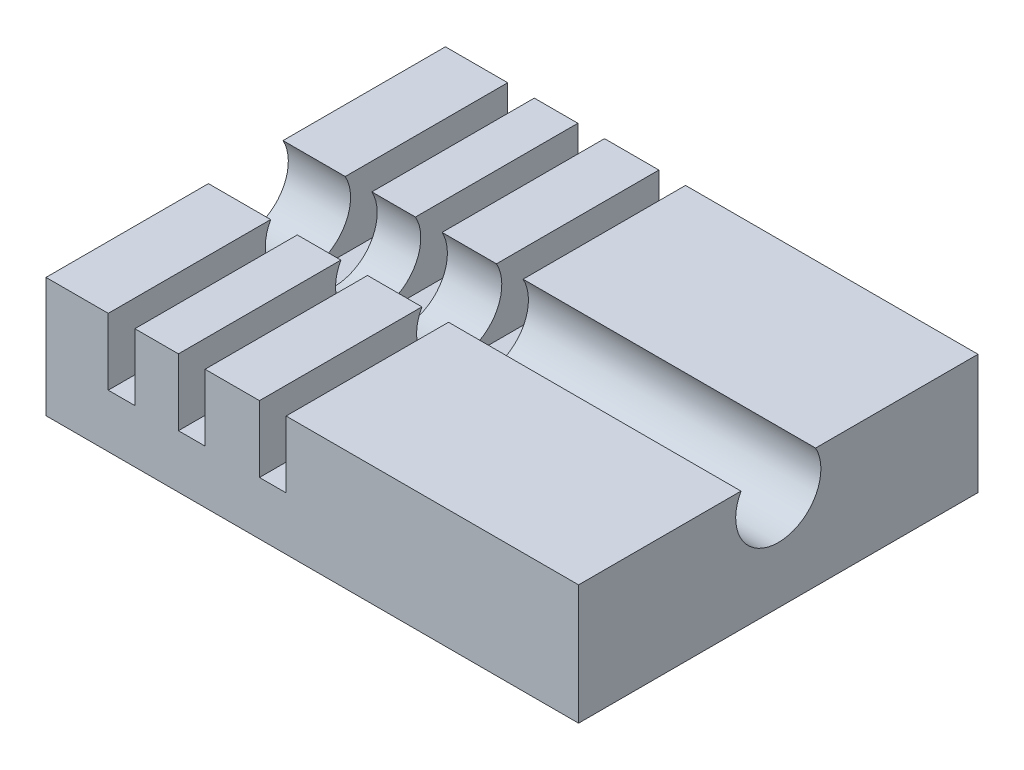
ISO-10303-21;
HEADER;
FILE_DESCRIPTION(('STEP AP214'),'2;1');
FILE_NAME('part.step','',(''),(''),'','','');
FILE_SCHEMA(('AUTOMOTIVE_DESIGN { 1 0 10303 214 1 1 1 1 }'));
ENDSEC;
DATA;
#1=APPLICATION_CONTEXT('core data for automotive mechanical design processes');
#2=APPLICATION_PROTOCOL_DEFINITION('international standard','automotive_design',2000,#1);
#3=PRODUCT_CONTEXT('',#1,'mechanical');
#4=PRODUCT('Part','Part','',(#3));
#5=PRODUCT_RELATED_PRODUCT_CATEGORY('part','',(#4));
#6=PRODUCT_DEFINITION_FORMATION('','',#4);
#7=PRODUCT_DEFINITION_CONTEXT('part definition',#1,'design');
#8=PRODUCT_DEFINITION('design','',#6,#7);
#9=PRODUCT_DEFINITION_SHAPE('','',#8);
#10=(LENGTH_UNIT() NAMED_UNIT(*) SI_UNIT(.MILLI.,.METRE.));
#11=(NAMED_UNIT(*) PLANE_ANGLE_UNIT() SI_UNIT($,.RADIAN.));
#12=(NAMED_UNIT(*) SI_UNIT($,.STERADIAN.) SOLID_ANGLE_UNIT());
#13=UNCERTAINTY_MEASURE_WITH_UNIT(LENGTH_MEASURE(1.E-05),#10,'distance_accuracy_value','');
#14=(GEOMETRIC_REPRESENTATION_CONTEXT(3) GLOBAL_UNCERTAINTY_ASSIGNED_CONTEXT((#13)) GLOBAL_UNIT_ASSIGNED_CONTEXT((#10,
#11,#12)) REPRESENTATION_CONTEXT('',''));
#15=CARTESIAN_POINT('',(0.,0.,0.));
#16=DIRECTION('',(0.,0.,1.));
#17=DIRECTION('',(1.,0.,0.));
#18=AXIS2_PLACEMENT_3D('',#15,#16,#17);
#19=CARTESIAN_POINT('',(0.,4.5,0.));
#20=DIRECTION('',(0.,1.,0.));
#21=DIRECTION('',(0.,0.,1.));
#22=AXIS2_PLACEMENT_3D('',#19,#20,#21);
#23=PLANE('',#22);
#24=DIRECTION('',(0.,0.,1.));
#25=VECTOR('',#24,1.);
#26=CARTESIAN_POINT('',(-1.98336935220311,4.5,7.5));
#27=LINE('',#26,#25);
#28=CARTESIAN_POINT('',(-1.98336935220311,4.5,1.40037517663878));
#29=VERTEX_POINT('',#28);
#30=CARTESIAN_POINT('',(-1.98336935220311,4.5,7.5));
#31=VERTEX_POINT('',#30);
#32=EDGE_CURVE('E207',#29,#31,#27,.T.);
#33=ORIENTED_EDGE('',*,*,#32,.F.);
#34=DIRECTION('',(1.,0.,0.));
#35=VECTOR('',#34,1.);
#36=CARTESIAN_POINT('',(-10.,4.5,1.40037517663879));
#37=LINE('',#36,#35);
#38=CARTESIAN_POINT('',(-4.02621229831845,4.5,1.40037517663879));
#39=VERTEX_POINT('',#38);
#40=EDGE_CURVE('E421',#39,#29,#37,.T.);
#41=ORIENTED_EDGE('',*,*,#40,.F.);
#42=DIRECTION('',(0.,0.,-1.));
#43=VECTOR('',#42,1.);
#44=CARTESIAN_POINT('',(-4.02621229831846,4.5,7.5));
#45=LINE('',#44,#43);
#46=CARTESIAN_POINT('',(-4.02621229831846,4.5,7.5));
#47=VERTEX_POINT('',#46);
#48=EDGE_CURVE('E63',#47,#39,#45,.T.);
#49=ORIENTED_EDGE('',*,*,#48,.F.);
#50=DIRECTION('',(1.,0.,0.));
#51=VECTOR('',#50,1.);
#52=CARTESIAN_POINT('',(-9.99999999999999,4.5,7.5));
#53=LINE('',#52,#51);
#54=EDGE_CURVE('E454',#47,#31,#53,.T.);
#55=ORIENTED_EDGE('',*,*,#54,.T.);
#56=EDGE_LOOP('',(#33,#41,#49,#55));
#57=FACE_BOUND('',#56,.T.);
#58=ADVANCED_FACE('F39',(#57),#23,.T.);
#59=CARTESIAN_POINT('',(-1.98336935220311,4.5,-7.5));
#60=VERTEX_POINT('',#59);
#61=CARTESIAN_POINT('',(-1.98336935220311,4.5,-1.40037517663878));
#62=VERTEX_POINT('',#61);
#63=EDGE_CURVE('E236',#60,#62,#27,.T.);
#64=ORIENTED_EDGE('',*,*,#63,.F.);
#65=DIRECTION('',(-1.,0.,0.));
#66=VECTOR('',#65,1.);
#67=CARTESIAN_POINT('',(-10.,4.5,-7.5));
#68=LINE('',#67,#66);
#69=CARTESIAN_POINT('',(-4.02621229831845,4.5,-7.5));
#70=VERTEX_POINT('',#69);
#71=EDGE_CURVE('E345',#60,#70,#68,.T.);
#72=ORIENTED_EDGE('',*,*,#71,.T.);
#73=CARTESIAN_POINT('',(-4.02621229831845,4.5,-1.40037517663878));
#74=VERTEX_POINT('',#73);
#75=EDGE_CURVE('E272',#74,#70,#45,.T.);
#76=ORIENTED_EDGE('',*,*,#75,.F.);
#77=DIRECTION('',(1.,0.,0.));
#78=VECTOR('',#77,1.);
#79=CARTESIAN_POINT('',(-10.,4.5,-1.40037517663878));
#80=LINE('',#79,#78);
#81=EDGE_CURVE('E390',#62,#74,#80,.F.);
#82=ORIENTED_EDGE('',*,*,#81,.F.);
#83=EDGE_LOOP('',(#64,#72,#76,#82));
#84=FACE_BOUND('',#83,.T.);
#85=ADVANCED_FACE('F466',(#84),#23,.T.);
#86=CARTESIAN_POINT('',(-10.,3.72608181010271,0.));
#87=DIRECTION('',(1.,0.,0.));
#88=DIRECTION('',(0.,0.,-1.));
#89=AXIS2_PLACEMENT_3D('',#86,#87,#88);
#90=CYLINDRICAL_SURFACE('',#89,1.6);
#91=ORIENTED_EDGE('',*,*,#40,.T.);
#92=CARTESIAN_POINT('',(-1.98336935220311,3.72608181010271,0.));
#93=DIRECTION('',(-1.,0.,0.));
#94=DIRECTION('',(0.,0.,1.));
#95=AXIS2_PLACEMENT_3D('',#92,#93,#94);
#96=CIRCLE('',#95,1.6);
#97=EDGE_CURVE('E11',#29,#62,#96,.F.);
#98=ORIENTED_EDGE('',*,*,#97,.T.);
#99=ORIENTED_EDGE('',*,*,#81,.T.);
#100=CARTESIAN_POINT('',(-4.02621229831846,3.72608181010271,0.));
#101=DIRECTION('',(1.,0.,0.));
#102=DIRECTION('',(0.,0.,-1.));
#103=AXIS2_PLACEMENT_3D('',#100,#101,#102);
#104=CIRCLE('',#103,1.6);
#105=EDGE_CURVE('E404',#74,#39,#104,.F.);
#106=ORIENTED_EDGE('',*,*,#105,.T.);
#107=EDGE_LOOP('',(#91,#98,#99,#106));
#108=FACE_BOUND('',#107,.T.);
#109=ADVANCED_FACE('F461',(#108),#90,.F.);
#110=DIRECTION('',(0.,0.,1.));
#111=VECTOR('',#110,1.);
#112=CARTESIAN_POINT('',(-5.02621229831846,4.5,7.5));
#113=LINE('',#112,#111);
#114=CARTESIAN_POINT('',(-5.02621229831846,4.5,1.40037517663879));
#115=VERTEX_POINT('',#114);
#116=CARTESIAN_POINT('',(-5.02621229831846,4.5,7.5));
#117=VERTEX_POINT('',#116);
#118=EDGE_CURVE('E245',#115,#117,#113,.T.);
#119=ORIENTED_EDGE('',*,*,#118,.F.);
#120=CARTESIAN_POINT('',(-6.66235726143166,4.5,1.40037517663879));
#121=VERTEX_POINT('',#120);
#122=EDGE_CURVE('E396',#121,#115,#37,.T.);
#123=ORIENTED_EDGE('',*,*,#122,.F.);
#124=DIRECTION('',(0.,0.,-1.));
#125=VECTOR('',#124,1.);
#126=CARTESIAN_POINT('',(-6.66235726143166,4.5,-7.5));
#127=LINE('',#126,#125);
#128=CARTESIAN_POINT('',(-6.66235726143166,4.5,7.5));
#129=VERTEX_POINT('',#128);
#130=EDGE_CURVE('E294',#129,#121,#127,.T.);
#131=ORIENTED_EDGE('',*,*,#130,.F.);
#132=EDGE_CURVE('E356',#129,#117,#53,.T.);
#133=ORIENTED_EDGE('',*,*,#132,.T.);
#134=EDGE_LOOP('',(#119,#123,#131,#133));
#135=FACE_BOUND('',#134,.T.);
#136=ADVANCED_FACE('F436',(#135),#23,.T.);
#137=CARTESIAN_POINT('',(-5.02621229831846,4.5,-7.5));
#138=VERTEX_POINT('',#137);
#139=CARTESIAN_POINT('',(-5.02621229831846,4.5,-1.40037517663878));
#140=VERTEX_POINT('',#139);
#141=EDGE_CURVE('E269',#138,#140,#113,.T.);
#142=ORIENTED_EDGE('',*,*,#141,.F.);
#143=CARTESIAN_POINT('',(-6.66235726143166,4.5,-7.5));
#144=VERTEX_POINT('',#143);
#145=EDGE_CURVE('E449',#138,#144,#68,.T.);
#146=ORIENTED_EDGE('',*,*,#145,.T.);
#147=CARTESIAN_POINT('',(-6.66235726143166,4.5,-1.40037517663878));
#148=VERTEX_POINT('',#147);
#149=EDGE_CURVE('E310',#148,#144,#127,.T.);
#150=ORIENTED_EDGE('',*,*,#149,.F.);
#151=EDGE_CURVE('E458',#140,#148,#80,.F.);
#152=ORIENTED_EDGE('',*,*,#151,.F.);
#153=EDGE_LOOP('',(#142,#146,#150,#152));
#154=FACE_BOUND('',#153,.T.);
#155=ADVANCED_FACE('F524',(#154),#23,.T.);
#156=ORIENTED_EDGE('',*,*,#122,.T.);
#157=CARTESIAN_POINT('',(-5.02621229831846,3.72608181010271,0.));
#158=DIRECTION('',(-1.,0.,0.));
#159=DIRECTION('',(0.,0.,1.));
#160=AXIS2_PLACEMENT_3D('',#157,#158,#159);
#161=CIRCLE('',#160,1.6);
#162=EDGE_CURVE('E407',#115,#140,#161,.F.);
#163=ORIENTED_EDGE('',*,*,#162,.T.);
#164=ORIENTED_EDGE('',*,*,#151,.T.);
#165=CARTESIAN_POINT('',(-6.66235726143166,3.72608181010271,0.));
#166=DIRECTION('',(1.,0.,0.));
#167=DIRECTION('',(0.,0.,-1.));
#168=AXIS2_PLACEMENT_3D('',#165,#166,#167);
#169=CIRCLE('',#168,1.6);
#170=EDGE_CURVE('E395',#148,#121,#169,.F.);
#171=ORIENTED_EDGE('',*,*,#170,.T.);
#172=EDGE_LOOP('',(#156,#163,#164,#171));
#173=FACE_BOUND('',#172,.T.);
#174=ADVANCED_FACE('F430',(#173),#90,.F.);
#175=DIRECTION('',(0.,0.,1.));
#176=VECTOR('',#175,1.);
#177=CARTESIAN_POINT('',(-7.66235726143166,4.5,-7.5));
#178=LINE('',#177,#176);
#179=CARTESIAN_POINT('',(-7.66235726143166,4.5,1.40037517663879));
#180=VERTEX_POINT('',#179);
#181=CARTESIAN_POINT('',(-7.66235726143166,4.5,7.5));
#182=VERTEX_POINT('',#181);
#183=EDGE_CURVE('E278',#180,#182,#178,.T.);
#184=ORIENTED_EDGE('',*,*,#183,.F.);
#185=CARTESIAN_POINT('',(-10.,4.5,1.40037517663879));
#186=VERTEX_POINT('',#185);
#187=EDGE_CURVE('E391',#186,#180,#37,.T.);
#188=ORIENTED_EDGE('',*,*,#187,.F.);
#189=DIRECTION('',(0.,0.,1.));
#190=VECTOR('',#189,1.);
#191=CARTESIAN_POINT('',(-10.,4.5,-7.5));
#192=LINE('',#191,#190);
#193=CARTESIAN_POINT('',(-9.99999999999999,4.5,7.5));
#194=VERTEX_POINT('',#193);
#195=EDGE_CURVE('E344',#186,#194,#192,.T.);
#196=ORIENTED_EDGE('',*,*,#195,.T.);
#197=EDGE_CURVE('E351',#194,#182,#53,.T.);
#198=ORIENTED_EDGE('',*,*,#197,.T.);
#199=EDGE_LOOP('',(#184,#188,#196,#198));
#200=FACE_BOUND('',#199,.T.);
#201=ADVANCED_FACE('F503',(#200),#23,.T.);
#202=CARTESIAN_POINT('',(-7.66235726143166,4.5,-7.5));
#203=VERTEX_POINT('',#202);
#204=CARTESIAN_POINT('',(-7.66235726143166,4.5,-1.40037517663878));
#205=VERTEX_POINT('',#204);
#206=EDGE_CURVE('E307',#203,#205,#178,.T.);
#207=ORIENTED_EDGE('',*,*,#206,.F.);
#208=CARTESIAN_POINT('',(-10.,4.5,-7.5));
#209=VERTEX_POINT('',#208);
#210=EDGE_CURVE('E338',#203,#209,#68,.T.);
#211=ORIENTED_EDGE('',*,*,#210,.T.);
#212=CARTESIAN_POINT('',(-10.,4.5,-1.40037517663878));
#213=VERTEX_POINT('',#212);
#214=EDGE_CURVE('E346',#209,#213,#192,.T.);
#215=ORIENTED_EDGE('',*,*,#214,.T.);
#216=EDGE_CURVE('E384',#205,#213,#80,.F.);
#217=ORIENTED_EDGE('',*,*,#216,.F.);
#218=EDGE_LOOP('',(#207,#211,#215,#217));
#219=FACE_BOUND('',#218,.T.);
#220=ADVANCED_FACE('F509',(#219),#23,.T.);
#221=ORIENTED_EDGE('',*,*,#187,.T.);
#222=CARTESIAN_POINT('',(-7.66235726143166,3.72608181010271,0.));
#223=DIRECTION('',(-1.,0.,0.));
#224=DIRECTION('',(0.,0.,1.));
#225=AXIS2_PLACEMENT_3D('',#222,#223,#224);
#226=CIRCLE('',#225,1.6);
#227=EDGE_CURVE('E400',#180,#205,#226,.F.);
#228=ORIENTED_EDGE('',*,*,#227,.T.);
#229=ORIENTED_EDGE('',*,*,#216,.T.);
#230=CARTESIAN_POINT('',(-10.,3.72608181010271,0.));
#231=DIRECTION('',(1.,0.,0.));
#232=DIRECTION('',(0.,0.,-1.));
#233=AXIS2_PLACEMENT_3D('',#230,#231,#232);
#234=CIRCLE('',#233,1.6);
#235=EDGE_CURVE('E327',#186,#213,#234,.T.);
#236=ORIENTED_EDGE('',*,*,#235,.F.);
#237=EDGE_LOOP('',(#221,#228,#229,#236));
#238=FACE_BOUND('',#237,.T.);
#239=ADVANCED_FACE('F505',(#238),#90,.F.);
#240=DIRECTION('',(0.,0.,-1.));
#241=VECTOR('',#240,1.);
#242=CARTESIAN_POINT('',(-0.983369352203113,4.5,7.5));
#243=LINE('',#242,#241);
#244=CARTESIAN_POINT('',(-0.983369352203113,4.5,7.5));
#245=VERTEX_POINT('',#244);
#246=CARTESIAN_POINT('',(-0.983369352203112,4.5,1.40037517663878));
#247=VERTEX_POINT('',#246);
#248=EDGE_CURVE('E55',#245,#247,#243,.T.);
#249=ORIENTED_EDGE('',*,*,#248,.F.);
#250=CARTESIAN_POINT('',(10.,4.5,7.5));
#251=VERTEX_POINT('',#250);
#252=EDGE_CURVE('E350',#245,#251,#53,.T.);
#253=ORIENTED_EDGE('',*,*,#252,.T.);
#254=DIRECTION('',(0.,0.,-1.));
#255=VECTOR('',#254,1.);
#256=CARTESIAN_POINT('',(10.,4.5,-7.5));
#257=LINE('',#256,#255);
#258=CARTESIAN_POINT('',(10.,4.5,1.40037517663878));
#259=VERTEX_POINT('',#258);
#260=EDGE_CURVE('E334',#251,#259,#257,.T.);
#261=ORIENTED_EDGE('',*,*,#260,.T.);
#262=EDGE_CURVE('E389',#247,#259,#37,.T.);
#263=ORIENTED_EDGE('',*,*,#262,.F.);
#264=EDGE_LOOP('',(#249,#253,#261,#263));
#265=FACE_BOUND('',#264,.T.);
#266=ADVANCED_FACE('F418',(#265),#23,.T.);
#267=CARTESIAN_POINT('',(10.,4.5,-7.5));
#268=DIRECTION('',(-1.,0.,0.));
#269=DIRECTION('',(0.,0.,1.));
#270=AXIS2_PLACEMENT_3D('',#267,#268,#269);
#271=PLANE('',#270);
#272=CARTESIAN_POINT('',(10.,4.5,-1.40037517663879));
#273=VERTEX_POINT('',#272);
#274=CARTESIAN_POINT('',(10.,4.5,-7.5));
#275=VERTEX_POINT('',#274);
#276=EDGE_CURVE('E339',#273,#275,#257,.T.);
#277=ORIENTED_EDGE('',*,*,#276,.F.);
#278=CARTESIAN_POINT('',(10.,3.72608181010271,0.));
#279=DIRECTION('',(1.,0.,0.));
#280=DIRECTION('',(0.,0.,-1.));
#281=AXIS2_PLACEMENT_3D('',#278,#279,#280);
#282=CIRCLE('',#281,1.6);
#283=EDGE_CURVE('E316',#259,#273,#282,.T.);
#284=ORIENTED_EDGE('',*,*,#283,.F.);
#285=ORIENTED_EDGE('',*,*,#260,.F.);
#286=DIRECTION('',(0.,-1.,0.));
#287=VECTOR('',#286,1.);
#288=CARTESIAN_POINT('',(10.,4.5,7.5));
#289=LINE('',#288,#287);
#290=CARTESIAN_POINT('',(10.,0.,7.5));
#291=VERTEX_POINT('',#290);
#292=EDGE_CURVE('E355',#251,#291,#289,.T.);
#293=ORIENTED_EDGE('',*,*,#292,.T.);
#294=DIRECTION('',(0.,0.,-1.));
#295=VECTOR('',#294,1.);
#296=CARTESIAN_POINT('',(10.,0.,-7.5));
#297=LINE('',#296,#295);
#298=CARTESIAN_POINT('',(10.,0.,-7.5));
#299=VERTEX_POINT('',#298);
#300=EDGE_CURVE('E331',#291,#299,#297,.T.);
#301=ORIENTED_EDGE('',*,*,#300,.T.);
#302=DIRECTION('',(0.,-1.,0.));
#303=VECTOR('',#302,1.);
#304=CARTESIAN_POINT('',(10.,4.5,-7.5));
#305=LINE('',#304,#303);
#306=EDGE_CURVE('E380',#275,#299,#305,.T.);
#307=ORIENTED_EDGE('',*,*,#306,.F.);
#308=EDGE_LOOP('',(#277,#284,#285,#293,#301,#307));
#309=FACE_BOUND('',#308,.T.);
#310=ADVANCED_FACE('F41',(#309),#271,.F.);
#311=CARTESIAN_POINT('',(-10.,4.5,-7.5));
#312=DIRECTION('',(0.,0.,1.));
#313=DIRECTION('',(1.,0.,0.));
#314=AXIS2_PLACEMENT_3D('',#311,#312,#313);
#315=PLANE('',#314);
#316=ORIENTED_EDGE('',*,*,#71,.F.);
#317=DIRECTION('',(0.,1.,0.));
#318=VECTOR('',#317,1.);
#319=CARTESIAN_POINT('',(-1.98336935220311,2.,-7.5));
#320=LINE('',#319,#318);
#321=CARTESIAN_POINT('',(-1.98336935220311,2.,-7.5));
#322=VERTEX_POINT('',#321);
#323=EDGE_CURVE('E242',#322,#60,#320,.T.);
#324=ORIENTED_EDGE('',*,*,#323,.F.);
#325=DIRECTION('',(-1.,0.,0.));
#326=VECTOR('',#325,1.);
#327=CARTESIAN_POINT('',(-1.98336935220311,2.,-7.5));
#328=LINE('',#327,#326);
#329=CARTESIAN_POINT('',(-0.983369352203112,2.,-7.5));
#330=VERTEX_POINT('',#329);
#331=EDGE_CURVE('E214',#330,#322,#328,.T.);
#332=ORIENTED_EDGE('',*,*,#331,.F.);
#333=DIRECTION('',(0.,1.,0.));
#334=VECTOR('',#333,1.);
#335=CARTESIAN_POINT('',(-0.983369352203112,2.,-7.5));
#336=LINE('',#335,#334);
#337=CARTESIAN_POINT('',(-0.983369352203112,4.5,-7.5));
#338=VERTEX_POINT('',#337);
#339=EDGE_CURVE('E246',#330,#338,#336,.T.);
#340=ORIENTED_EDGE('',*,*,#339,.T.);
#341=EDGE_CURVE('E340',#275,#338,#68,.T.);
#342=ORIENTED_EDGE('',*,*,#341,.F.);
#343=ORIENTED_EDGE('',*,*,#306,.T.);
#344=DIRECTION('',(-1.,0.,0.));
#345=VECTOR('',#344,1.);
#346=CARTESIAN_POINT('',(-10.,0.,-7.5));
#347=LINE('',#346,#345);
#348=CARTESIAN_POINT('',(-10.,0.,-7.5));
#349=VERTEX_POINT('',#348);
#350=EDGE_CURVE('E360',#299,#349,#347,.T.);
#351=ORIENTED_EDGE('',*,*,#350,.T.);
#352=DIRECTION('',(0.,-1.,0.));
#353=VECTOR('',#352,1.);
#354=CARTESIAN_POINT('',(-10.,4.5,-7.5));
#355=LINE('',#354,#353);
#356=EDGE_CURVE('E376',#209,#349,#355,.T.);
#357=ORIENTED_EDGE('',*,*,#356,.F.);
#358=ORIENTED_EDGE('',*,*,#210,.F.);
#359=DIRECTION('',(0.,1.,0.));
#360=VECTOR('',#359,1.);
#361=CARTESIAN_POINT('',(-7.66235726143166,2.,-7.5));
#362=LINE('',#361,#360);
#363=CARTESIAN_POINT('',(-7.66235726143166,2.,-7.5));
#364=VERTEX_POINT('',#363);
#365=EDGE_CURVE('E313',#364,#203,#362,.T.);
#366=ORIENTED_EDGE('',*,*,#365,.F.);
#367=DIRECTION('',(-1.,0.,0.));
#368=VECTOR('',#367,1.);
#369=CARTESIAN_POINT('',(-7.66235726143166,2.,-7.5));
#370=LINE('',#369,#368);
#371=CARTESIAN_POINT('',(-6.66235726143166,2.,-7.5));
#372=VERTEX_POINT('',#371);
#373=EDGE_CURVE('E302',#372,#364,#370,.T.);
#374=ORIENTED_EDGE('',*,*,#373,.F.);
#375=DIRECTION('',(0.,1.,0.));
#376=VECTOR('',#375,1.);
#377=CARTESIAN_POINT('',(-6.66235726143166,2.,-7.5));
#378=LINE('',#377,#376);
#379=EDGE_CURVE('E317',#372,#144,#378,.T.);
#380=ORIENTED_EDGE('',*,*,#379,.T.);
#381=ORIENTED_EDGE('',*,*,#145,.F.);
#382=DIRECTION('',(0.,1.,0.));
#383=VECTOR('',#382,1.);
#384=CARTESIAN_POINT('',(-5.02621229831846,2.,-7.5));
#385=LINE('',#384,#383);
#386=CARTESIAN_POINT('',(-5.02621229831846,2.,-7.5));
#387=VERTEX_POINT('',#386);
#388=EDGE_CURVE('E275',#387,#138,#385,.T.);
#389=ORIENTED_EDGE('',*,*,#388,.F.);
#390=DIRECTION('',(-1.,0.,0.));
#391=VECTOR('',#390,1.);
#392=CARTESIAN_POINT('',(-5.02621229831846,2.,-7.5));
#393=LINE('',#392,#391);
#394=CARTESIAN_POINT('',(-4.02621229831845,2.,-7.5));
#395=VERTEX_POINT('',#394);
#396=EDGE_CURVE('E264',#395,#387,#393,.T.);
#397=ORIENTED_EDGE('',*,*,#396,.F.);
#398=DIRECTION('',(0.,1.,0.));
#399=VECTOR('',#398,1.);
#400=CARTESIAN_POINT('',(-4.02621229831845,2.,-7.5));
#401=LINE('',#400,#399);
#402=EDGE_CURVE('E279',#395,#70,#401,.T.);
#403=ORIENTED_EDGE('',*,*,#402,.T.);
#404=EDGE_LOOP('',(#316,#324,#332,#340,#342,#343,#351,#357,#358,#366,#374,#380,#381,#389,#397,#403));
#405=FACE_BOUND('',#404,.T.);
#406=ADVANCED_FACE('F469',(#405),#315,.F.);
#407=CARTESIAN_POINT('',(-10.,4.5,-7.5));
#408=DIRECTION('',(1.,0.,0.));
#409=DIRECTION('',(0.,0.,-1.));
#410=AXIS2_PLACEMENT_3D('',#407,#408,#409);
#411=PLANE('',#410);
#412=ORIENTED_EDGE('',*,*,#195,.F.);
#413=ORIENTED_EDGE('',*,*,#235,.T.);
#414=ORIENTED_EDGE('',*,*,#214,.F.);
#415=ORIENTED_EDGE('',*,*,#356,.T.);
#416=DIRECTION('',(0.,0.,1.));
#417=VECTOR('',#416,1.);
#418=CARTESIAN_POINT('',(-10.,0.,-7.5));
#419=LINE('',#418,#417);
#420=CARTESIAN_POINT('',(-9.99999999999999,0.,7.5));
#421=VERTEX_POINT('',#420);
#422=EDGE_CURVE('E363',#349,#421,#419,.T.);
#423=ORIENTED_EDGE('',*,*,#422,.T.);
#424=DIRECTION('',(0.,-1.,0.));
#425=VECTOR('',#424,1.);
#426=CARTESIAN_POINT('',(-9.99999999999999,4.5,7.5));
#427=LINE('',#426,#425);
#428=EDGE_CURVE('E372',#194,#421,#427,.T.);
#429=ORIENTED_EDGE('',*,*,#428,.F.);
#430=EDGE_LOOP('',(#412,#413,#414,#415,#423,#429));
#431=FACE_BOUND('',#430,.T.);
#432=ADVANCED_FACE('F494',(#431),#411,.F.);
#433=CARTESIAN_POINT('',(-9.99999999999999,4.5,7.5));
#434=DIRECTION('',(0.,0.,-1.));
#435=DIRECTION('',(-1.,0.,0.));
#436=AXIS2_PLACEMENT_3D('',#433,#434,#435);
#437=PLANE('',#436);
#438=DIRECTION('',(1.,0.,0.));
#439=VECTOR('',#438,1.);
#440=CARTESIAN_POINT('',(-1.98336935220311,2.,7.5));
#441=LINE('',#440,#439);
#442=CARTESIAN_POINT('',(-1.98336935220311,2.,7.5));
#443=VERTEX_POINT('',#442);
#444=CARTESIAN_POINT('',(-0.983369352203113,2.,7.5));
#445=VERTEX_POINT('',#444);
#446=EDGE_CURVE('E220',#443,#445,#441,.T.);
#447=ORIENTED_EDGE('',*,*,#446,.F.);
#448=DIRECTION('',(0.,1.,0.));
#449=VECTOR('',#448,1.);
#450=CARTESIAN_POINT('',(-1.98336935220311,2.,7.5));
#451=LINE('',#450,#449);
#452=EDGE_CURVE('E201',#443,#31,#451,.T.);
#453=ORIENTED_EDGE('',*,*,#452,.T.);
#454=ORIENTED_EDGE('',*,*,#54,.F.);
#455=DIRECTION('',(0.,1.,0.));
#456=VECTOR('',#455,1.);
#457=CARTESIAN_POINT('',(-4.02621229831846,2.,7.5));
#458=LINE('',#457,#456);
#459=CARTESIAN_POINT('',(-4.02621229831846,2.,7.5));
#460=VERTEX_POINT('',#459);
#461=EDGE_CURVE('E283',#460,#47,#458,.T.);
#462=ORIENTED_EDGE('',*,*,#461,.F.);
#463=DIRECTION('',(1.,0.,0.));
#464=VECTOR('',#463,1.);
#465=CARTESIAN_POINT('',(-5.02621229831846,2.,7.5));
#466=LINE('',#465,#464);
#467=CARTESIAN_POINT('',(-5.02621229831846,2.,7.5));
#468=VERTEX_POINT('',#467);
#469=EDGE_CURVE('E256',#468,#460,#466,.T.);
#470=ORIENTED_EDGE('',*,*,#469,.F.);
#471=DIRECTION('',(0.,1.,0.));
#472=VECTOR('',#471,1.);
#473=CARTESIAN_POINT('',(-5.02621229831846,2.,7.5));
#474=LINE('',#473,#472);
#475=EDGE_CURVE('E268',#468,#117,#474,.T.);
#476=ORIENTED_EDGE('',*,*,#475,.T.);
#477=ORIENTED_EDGE('',*,*,#132,.F.);
#478=DIRECTION('',(0.,1.,0.));
#479=VECTOR('',#478,1.);
#480=CARTESIAN_POINT('',(-6.66235726143166,2.,7.5));
#481=LINE('',#480,#479);
#482=CARTESIAN_POINT('',(-6.66235726143166,2.,7.5));
#483=VERTEX_POINT('',#482);
#484=EDGE_CURVE('E321',#483,#129,#481,.T.);
#485=ORIENTED_EDGE('',*,*,#484,.F.);
#486=DIRECTION('',(1.,0.,0.));
#487=VECTOR('',#486,1.);
#488=CARTESIAN_POINT('',(-7.66235726143166,2.,7.5));
#489=LINE('',#488,#487);
#490=CARTESIAN_POINT('',(-7.66235726143166,2.,7.5));
#491=VERTEX_POINT('',#490);
#492=EDGE_CURVE('E293',#491,#483,#489,.T.);
#493=ORIENTED_EDGE('',*,*,#492,.F.);
#494=DIRECTION('',(0.,1.,0.));
#495=VECTOR('',#494,1.);
#496=CARTESIAN_POINT('',(-7.66235726143166,2.,7.5));
#497=LINE('',#496,#495);
#498=EDGE_CURVE('E306',#491,#182,#497,.T.);
#499=ORIENTED_EDGE('',*,*,#498,.T.);
#500=ORIENTED_EDGE('',*,*,#197,.F.);
#501=ORIENTED_EDGE('',*,*,#428,.T.);
#502=DIRECTION('',(1.,0.,0.));
#503=VECTOR('',#502,1.);
#504=CARTESIAN_POINT('',(-9.99999999999999,0.,7.5));
#505=LINE('',#504,#503);
#506=EDGE_CURVE('E366',#421,#291,#505,.T.);
#507=ORIENTED_EDGE('',*,*,#506,.T.);
#508=ORIENTED_EDGE('',*,*,#292,.F.);
#509=ORIENTED_EDGE('',*,*,#252,.F.);
#510=DIRECTION('',(0.,1.,0.));
#511=VECTOR('',#510,1.);
#512=CARTESIAN_POINT('',(-0.983369352203113,2.,7.5));
#513=LINE('',#512,#511);
#514=EDGE_CURVE('E213',#445,#245,#513,.T.);
#515=ORIENTED_EDGE('',*,*,#514,.F.);
#516=EDGE_LOOP('',(#447,#453,#454,#462,#470,#476,#477,#485,#493,#499,#500,#501,#507,#508,#509,#515));
#517=FACE_BOUND('',#516,.T.);
#518=ADVANCED_FACE('F226',(#517),#437,.F.);
#519=CARTESIAN_POINT('',(-0.983369352203112,4.5,-1.40037517663878));
#520=VERTEX_POINT('',#519);
#521=EDGE_CURVE('E239',#520,#338,#243,.T.);
#522=ORIENTED_EDGE('',*,*,#521,.F.);
#523=EDGE_CURVE('E385',#273,#520,#80,.F.);
#524=ORIENTED_EDGE('',*,*,#523,.F.);
#525=ORIENTED_EDGE('',*,*,#276,.T.);
#526=ORIENTED_EDGE('',*,*,#341,.T.);
#527=EDGE_LOOP('',(#522,#524,#525,#526));
#528=FACE_BOUND('',#527,.T.);
#529=ADVANCED_FACE('F483',(#528),#23,.T.);
#530=CARTESIAN_POINT('',(0.,0.,0.));
#531=DIRECTION('',(0.,1.,0.));
#532=DIRECTION('',(0.,0.,1.));
#533=AXIS2_PLACEMENT_3D('',#530,#531,#532);
#534=PLANE('',#533);
#535=ORIENTED_EDGE('',*,*,#300,.F.);
#536=ORIENTED_EDGE('',*,*,#506,.F.);
#537=ORIENTED_EDGE('',*,*,#422,.F.);
#538=ORIENTED_EDGE('',*,*,#350,.F.);
#539=EDGE_LOOP('',(#535,#536,#537,#538));
#540=FACE_BOUND('',#539,.T.);
#541=ADVANCED_FACE('F497',(#540),#534,.F.);
#542=ORIENTED_EDGE('',*,*,#523,.T.);
#543=CARTESIAN_POINT('',(-0.983369352203114,3.72608181010271,0.));
#544=DIRECTION('',(1.,0.,0.));
#545=DIRECTION('',(0.,0.,-1.));
#546=AXIS2_PLACEMENT_3D('',#543,#544,#545);
#547=CIRCLE('',#546,1.6);
#548=EDGE_CURVE('E48',#520,#247,#547,.F.);
#549=ORIENTED_EDGE('',*,*,#548,.T.);
#550=ORIENTED_EDGE('',*,*,#262,.T.);
#551=ORIENTED_EDGE('',*,*,#283,.T.);
#552=EDGE_LOOP('',(#542,#549,#550,#551));
#553=FACE_BOUND('',#552,.T.);
#554=ADVANCED_FACE('F413',(#553),#90,.F.);
#555=CARTESIAN_POINT('',(-7.66235726143166,2.,-7.5));
#556=DIRECTION('',(-1.,0.,0.));
#557=DIRECTION('',(0.,0.,1.));
#558=AXIS2_PLACEMENT_3D('',#555,#556,#557);
#559=PLANE('',#558);
#560=ORIENTED_EDGE('',*,*,#183,.T.);
#561=ORIENTED_EDGE('',*,*,#498,.F.);
#562=DIRECTION('',(0.,0.,1.));
#563=VECTOR('',#562,1.);
#564=CARTESIAN_POINT('',(-7.66235726143166,2.,-7.5));
#565=LINE('',#564,#563);
#566=EDGE_CURVE('E289',#364,#491,#565,.T.);
#567=ORIENTED_EDGE('',*,*,#566,.F.);
#568=ORIENTED_EDGE('',*,*,#365,.T.);
#569=ORIENTED_EDGE('',*,*,#206,.T.);
#570=ORIENTED_EDGE('',*,*,#227,.F.);
#571=EDGE_LOOP('',(#560,#561,#567,#568,#569,#570));
#572=FACE_BOUND('',#571,.T.);
#573=ADVANCED_FACE('F513',(#572),#559,.F.);
#574=CARTESIAN_POINT('',(-6.66235726143166,2.,-7.5));
#575=DIRECTION('',(1.,0.,0.));
#576=DIRECTION('',(0.,0.,-1.));
#577=AXIS2_PLACEMENT_3D('',#574,#575,#576);
#578=PLANE('',#577);
#579=ORIENTED_EDGE('',*,*,#149,.T.);
#580=ORIENTED_EDGE('',*,*,#379,.F.);
#581=DIRECTION('',(0.,0.,-1.));
#582=VECTOR('',#581,1.);
#583=CARTESIAN_POINT('',(-6.66235726143166,2.,-7.5));
#584=LINE('',#583,#582);
#585=EDGE_CURVE('E298',#483,#372,#584,.T.);
#586=ORIENTED_EDGE('',*,*,#585,.F.);
#587=ORIENTED_EDGE('',*,*,#484,.T.);
#588=ORIENTED_EDGE('',*,*,#130,.T.);
#589=ORIENTED_EDGE('',*,*,#170,.F.);
#590=EDGE_LOOP('',(#579,#580,#586,#587,#588,#589));
#591=FACE_BOUND('',#590,.T.);
#592=ADVANCED_FACE('F519',(#591),#578,.F.);
#593=CARTESIAN_POINT('',(0.,2.,0.));
#594=DIRECTION('',(0.,1.,0.));
#595=DIRECTION('',(0.,0.,1.));
#596=AXIS2_PLACEMENT_3D('',#593,#594,#595);
#597=PLANE('',#596);
#598=ORIENTED_EDGE('',*,*,#566,.T.);
#599=ORIENTED_EDGE('',*,*,#492,.T.);
#600=ORIENTED_EDGE('',*,*,#585,.T.);
#601=ORIENTED_EDGE('',*,*,#373,.T.);
#602=EDGE_LOOP('',(#598,#599,#600,#601));
#603=FACE_BOUND('',#602,.T.);
#604=ADVANCED_FACE('F516',(#603),#597,.T.);
#605=CARTESIAN_POINT('',(-5.02621229831846,2.,7.5));
#606=DIRECTION('',(-1.,0.,0.));
#607=DIRECTION('',(0.,0.,1.));
#608=AXIS2_PLACEMENT_3D('',#605,#606,#607);
#609=PLANE('',#608);
#610=ORIENTED_EDGE('',*,*,#118,.T.);
#611=ORIENTED_EDGE('',*,*,#475,.F.);
#612=DIRECTION('',(0.,0.,1.));
#613=VECTOR('',#612,1.);
#614=CARTESIAN_POINT('',(-5.02621229831846,2.,7.5));
#615=LINE('',#614,#613);
#616=EDGE_CURVE('E252',#387,#468,#615,.T.);
#617=ORIENTED_EDGE('',*,*,#616,.F.);
#618=ORIENTED_EDGE('',*,*,#388,.T.);
#619=ORIENTED_EDGE('',*,*,#141,.T.);
#620=ORIENTED_EDGE('',*,*,#162,.F.);
#621=EDGE_LOOP('',(#610,#611,#617,#618,#619,#620));
#622=FACE_BOUND('',#621,.T.);
#623=ADVANCED_FACE('F525',(#622),#609,.F.);
#624=CARTESIAN_POINT('',(-4.02621229831846,2.,7.5));
#625=DIRECTION('',(1.,0.,0.));
#626=DIRECTION('',(0.,0.,-1.));
#627=AXIS2_PLACEMENT_3D('',#624,#625,#626);
#628=PLANE('',#627);
#629=ORIENTED_EDGE('',*,*,#75,.T.);
#630=ORIENTED_EDGE('',*,*,#402,.F.);
#631=DIRECTION('',(0.,0.,-1.));
#632=VECTOR('',#631,1.);
#633=CARTESIAN_POINT('',(-4.02621229831846,2.,7.5));
#634=LINE('',#633,#632);
#635=EDGE_CURVE('E260',#460,#395,#634,.T.);
#636=ORIENTED_EDGE('',*,*,#635,.F.);
#637=ORIENTED_EDGE('',*,*,#461,.T.);
#638=ORIENTED_EDGE('',*,*,#48,.T.);
#639=ORIENTED_EDGE('',*,*,#105,.F.);
#640=EDGE_LOOP('',(#629,#630,#636,#637,#638,#639));
#641=FACE_BOUND('',#640,.T.);
#642=ADVANCED_FACE('F465',(#641),#628,.F.);
#643=CARTESIAN_POINT('',(0.,2.,0.));
#644=DIRECTION('',(0.,-1.,0.));
#645=DIRECTION('',(0.,0.,-1.));
#646=AXIS2_PLACEMENT_3D('',#643,#644,#645);
#647=PLANE('',#646);
#648=ORIENTED_EDGE('',*,*,#616,.T.);
#649=ORIENTED_EDGE('',*,*,#469,.T.);
#650=ORIENTED_EDGE('',*,*,#635,.T.);
#651=ORIENTED_EDGE('',*,*,#396,.T.);
#652=EDGE_LOOP('',(#648,#649,#650,#651));
#653=FACE_BOUND('',#652,.T.);
#654=ADVANCED_FACE('F473',(#653),#647,.F.);
#655=CARTESIAN_POINT('',(-1.98336935220311,2.,7.5));
#656=DIRECTION('',(-1.,0.,0.));
#657=DIRECTION('',(0.,0.,1.));
#658=AXIS2_PLACEMENT_3D('',#655,#656,#657);
#659=PLANE('',#658);
#660=ORIENTED_EDGE('',*,*,#32,.T.);
#661=ORIENTED_EDGE('',*,*,#452,.F.);
#662=DIRECTION('',(0.,0.,1.));
#663=VECTOR('',#662,1.);
#664=CARTESIAN_POINT('',(-1.98336935220311,2.,7.5));
#665=LINE('',#664,#663);
#666=EDGE_CURVE('E204',#322,#443,#665,.T.);
#667=ORIENTED_EDGE('',*,*,#666,.F.);
#668=ORIENTED_EDGE('',*,*,#323,.T.);
#669=ORIENTED_EDGE('',*,*,#63,.T.);
#670=ORIENTED_EDGE('',*,*,#97,.F.);
#671=EDGE_LOOP('',(#660,#661,#667,#668,#669,#670));
#672=FACE_BOUND('',#671,.T.);
#673=ADVANCED_FACE('F203',(#672),#659,.F.);
#674=CARTESIAN_POINT('',(-0.983369352203113,2.,7.5));
#675=DIRECTION('',(1.,0.,0.));
#676=DIRECTION('',(0.,0.,-1.));
#677=AXIS2_PLACEMENT_3D('',#674,#675,#676);
#678=PLANE('',#677);
#679=ORIENTED_EDGE('',*,*,#521,.T.);
#680=ORIENTED_EDGE('',*,*,#339,.F.);
#681=DIRECTION('',(0.,0.,-1.));
#682=VECTOR('',#681,1.);
#683=CARTESIAN_POINT('',(-0.983369352203113,2.,7.5));
#684=LINE('',#683,#682);
#685=EDGE_CURVE('E229',#445,#330,#684,.T.);
#686=ORIENTED_EDGE('',*,*,#685,.F.);
#687=ORIENTED_EDGE('',*,*,#514,.T.);
#688=ORIENTED_EDGE('',*,*,#248,.T.);
#689=ORIENTED_EDGE('',*,*,#548,.F.);
#690=EDGE_LOOP('',(#679,#680,#686,#687,#688,#689));
#691=FACE_BOUND('',#690,.T.);
#692=ADVANCED_FACE('F479',(#691),#678,.F.);
#693=CARTESIAN_POINT('',(0.,2.,0.));
#694=DIRECTION('',(0.,-1.,0.));
#695=DIRECTION('',(0.,0.,-1.));
#696=AXIS2_PLACEMENT_3D('',#693,#694,#695);
#697=PLANE('',#696);
#698=ORIENTED_EDGE('',*,*,#666,.T.);
#699=ORIENTED_EDGE('',*,*,#446,.T.);
#700=ORIENTED_EDGE('',*,*,#685,.T.);
#701=ORIENTED_EDGE('',*,*,#331,.T.);
#702=EDGE_LOOP('',(#698,#699,#700,#701));
#703=FACE_BOUND('',#702,.T.);
#704=ADVANCED_FACE('F218',(#703),#697,.F.);
#705=CLOSED_SHELL('',(#58,#85,#109,#136,#155,#174,#201,#220,#239,#266,#310,#406,#432,#518,#529,
#541,#554,#573,#592,#604,#623,#642,#654,#673,#692,#704));
#706=MANIFOLD_SOLID_BREP('B2',#705);
#707=ADVANCED_BREP_SHAPE_REPRESENTATION('',(#18,#706),#14);
#708=SHAPE_DEFINITION_REPRESENTATION(#9,#707);
ENDSEC;
END-ISO-10303-21;
